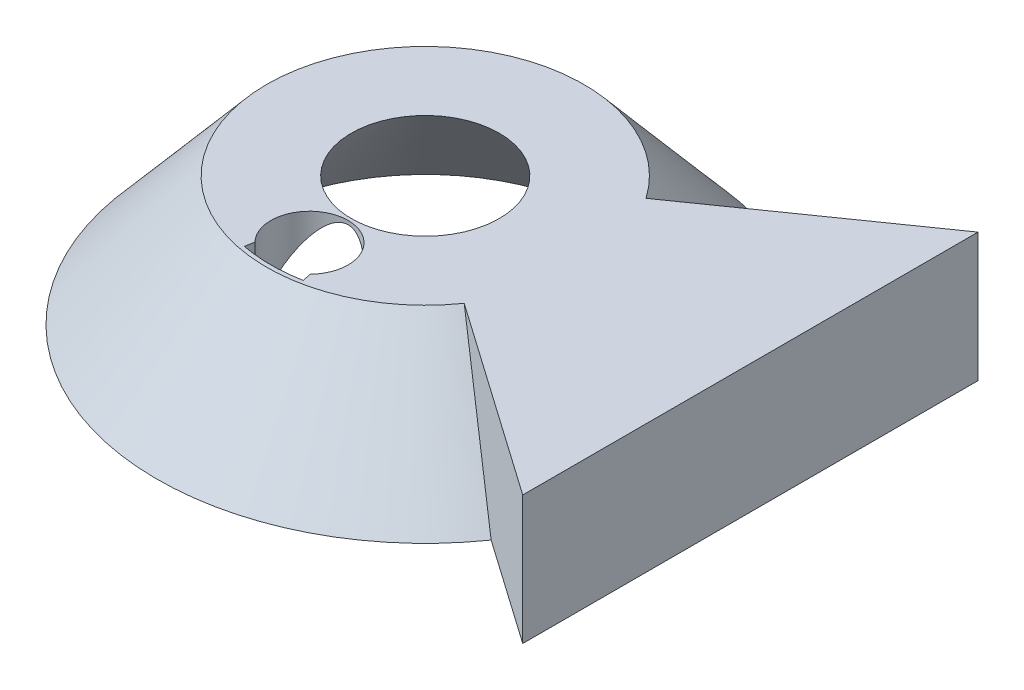
ISO-10303-21;
HEADER;
FILE_DESCRIPTION(('STEP AP214'),'2;1');
FILE_NAME('part.step','',(''),(''),'','','');
FILE_SCHEMA(('AUTOMOTIVE_DESIGN { 1 0 10303 214 1 1 1 1 }'));
ENDSEC;
DATA;
#1=APPLICATION_CONTEXT('core data for automotive mechanical design processes');
#2=APPLICATION_PROTOCOL_DEFINITION('international standard','automotive_design',2000,#1);
#3=PRODUCT_CONTEXT('',#1,'mechanical');
#4=PRODUCT('Part','Part','',(#3));
#5=PRODUCT_RELATED_PRODUCT_CATEGORY('part','',(#4));
#6=PRODUCT_DEFINITION_FORMATION('','',#4);
#7=PRODUCT_DEFINITION_CONTEXT('part definition',#1,'design');
#8=PRODUCT_DEFINITION('design','',#6,#7);
#9=PRODUCT_DEFINITION_SHAPE('','',#8);
#10=(LENGTH_UNIT() NAMED_UNIT(*) SI_UNIT(.MILLI.,.METRE.));
#11=(NAMED_UNIT(*) PLANE_ANGLE_UNIT() SI_UNIT($,.RADIAN.));
#12=(NAMED_UNIT(*) SI_UNIT($,.STERADIAN.) SOLID_ANGLE_UNIT());
#13=UNCERTAINTY_MEASURE_WITH_UNIT(LENGTH_MEASURE(1.E-05),#10,'distance_accuracy_value','');
#14=(GEOMETRIC_REPRESENTATION_CONTEXT(3) GLOBAL_UNCERTAINTY_ASSIGNED_CONTEXT((#13)) GLOBAL_UNIT_ASSIGNED_CONTEXT((#10,
#11,#12)) REPRESENTATION_CONTEXT('',''));
#15=CARTESIAN_POINT('',(0.,0.,0.));
#16=DIRECTION('',(0.,0.,1.));
#17=DIRECTION('',(1.,0.,0.));
#18=AXIS2_PLACEMENT_3D('',#15,#16,#17);
#19=CARTESIAN_POINT('',(0.,20.,0.));
#20=DIRECTION('',(0.,-1.,0.));
#21=DIRECTION('',(0.,0.,-1.));
#22=AXIS2_PLACEMENT_3D('',#19,#20,#21);
#23=CONICAL_SURFACE('',#22,11.5,0.705943653717558);
#24=CARTESIAN_POINT('',(0.,20.,0.));
#25=DIRECTION('',(0.,-1.,0.));
#26=DIRECTION('',(0.,0.,-1.));
#27=AXIS2_PLACEMENT_3D('',#24,#25,#26);
#28=CIRCLE('',#27,11.5);
#29=CARTESIAN_POINT('',(0.,20.,-11.5));
#30=VERTEX_POINT('',#29);
#31=EDGE_CURVE('E186',#30,#30,#28,.T.);
#32=ORIENTED_EDGE('',*,*,#31,.F.);
#33=EDGE_LOOP('',(#32));
#34=FACE_BOUND('',#33,.T.);
#35=CARTESIAN_POINT('',(0.,0.,0.));
#36=DIRECTION('',(0.,-1.,0.));
#37=DIRECTION('',(0.,0.,-1.));
#38=AXIS2_PLACEMENT_3D('',#35,#36,#37);
#39=CIRCLE('',#38,28.55);
#40=CARTESIAN_POINT('',(-5.44759681800036,0.,28.0254560874308));
#41=VERTEX_POINT('',#40);
#42=CARTESIAN_POINT('',(5.44759681800036,0.,28.0254560874308));
#43=VERTEX_POINT('',#42);
#44=EDGE_CURVE('E183',#41,#43,#39,.T.);
#45=ORIENTED_EDGE('',*,*,#44,.T.);
#46=DIRECTION('',(-0.123787762870703,0.760999693219683,-0.636832832604457));
#47=VECTOR('',#46,1.);
#48=CARTESIAN_POINT('',(0.,33.4897360703812,0.));
#49=LINE('',#48,#47);
#50=CARTESIAN_POINT('',(4.31018887788478,6.99234781710755,22.1739995013127));
#51=VERTEX_POINT('',#50);
#52=EDGE_CURVE('E143',#43,#51,#49,.T.);
#53=ORIENTED_EDGE('',*,*,#52,.T.);
#54=CARTESIAN_POINT('',(-1.86294938744595,5.59935199587434,23.7034568096738));
#55=CARTESIAN_POINT('',(-1.74380419760398,5.56479048565835,23.7423760429648));
#56=CARTESIAN_POINT('',(-1.62263230867238,5.53338015263106,23.7778186288156));
#57=CARTESIAN_POINT('',(-1.37685508627445,5.47722805546746,23.8412637521039));
#58=CARTESIAN_POINT('',(-1.25225062509791,5.45248461405185,23.8692681608382));
#59=CARTESIAN_POINT('',(-1.00028195179229,5.40997738774682,23.9174233599859));
#60=CARTESIAN_POINT('',(-0.872916190202574,5.3922176345229,23.9375696138524));
#61=CARTESIAN_POINT('',(-0.616405106274186,5.36395179737651,23.9696518118307));
#62=CARTESIAN_POINT('',(-0.487260515654808,5.35344281668845,23.981591034737));
#63=CARTESIAN_POINT('',(-0.227830250952314,5.33980845950456,23.9970835687338));
#64=CARTESIAN_POINT('',(-0.0975428660866593,5.33669725207927,24.0006207873209));
#65=CARTESIAN_POINT('',(0.162950907603768,5.33794637877211,23.9992009525263));
#66=CARTESIAN_POINT('',(0.293157295526494,5.34230679466108,23.9942438061808));
#67=CARTESIAN_POINT('',(0.552485304779401,5.35843251608129,23.9759228006164));
#68=CARTESIAN_POINT('',(0.68160714807975,5.37019626703128,23.9625607063016));
#69=CARTESIAN_POINT('',(0.937909342353687,5.40096028314342,23.9276523423152));
#70=CARTESIAN_POINT('',(1.06508896715261,5.41996318922954,23.9061030858838));
#71=CARTESIAN_POINT('',(1.31404313697651,5.4644827410833,23.8556883358527));
#72=CARTESIAN_POINT('',(1.43587502060802,5.48985852872847,23.8269811396661));
#73=CARTESIAN_POINT('',(1.67613502864785,5.54698032016049,23.7624706795175));
#74=CARTESIAN_POINT('',(1.79456195338372,5.57872853845588,23.7266649487691));
#75=CARTESIAN_POINT('',(2.14373823381104,5.68298002704705,23.6093279242177));
#76=CARTESIAN_POINT('',(2.36856216446425,5.764522810815,23.517839598931));
#77=CARTESIAN_POINT('',(2.81916516846089,5.95719008395895,23.3028824718996));
#78=CARTESIAN_POINT('',(3.04296616906288,6.07040218896967,23.1771874562883));
#79=CARTESIAN_POINT('',(3.46485607359706,6.31747784537985,22.904888212415));
#80=CARTESIAN_POINT('',(3.66292823216758,6.45135472345159,22.7582704957834));
#81=CARTESIAN_POINT('',(4.12967888533117,6.81063571254922,22.3681268818901));
#82=CARTESIAN_POINT('',(4.38104973490738,7.04726935838683,22.1140454775121));
#83=CARTESIAN_POINT('',(4.7135905544143,7.42321298352985,21.7164676229729));
#84=CARTESIAN_POINT('',(4.81714015607364,7.5522360494114,21.5809831048258));
#85=CARTESIAN_POINT('',(5.00998925325655,7.81637161569437,21.3057815616582));
#86=CARTESIAN_POINT('',(5.09928861090755,7.95148417499605,21.166064495703));
#87=CARTESIAN_POINT('',(5.29421299527155,8.27706812742472,20.8321600757922));
#88=CARTESIAN_POINT('',(5.39391915442332,8.46976209278792,20.6366862364186));
#89=CARTESIAN_POINT('',(5.56927281955039,8.86285963225087,20.2427011992367));
#90=CARTESIAN_POINT('',(5.64491203183782,9.06326583744731,20.0441889790215));
#91=CARTESIAN_POINT('',(5.77357750894172,9.47032389697082,19.646081555344));
#92=CARTESIAN_POINT('',(5.82659230782181,9.67697886146192,19.4464858545468));
#93=CARTESIAN_POINT('',(5.9112857048035,10.0951639271261,19.0479519099164));
#94=CARTESIAN_POINT('',(5.94296430856114,10.3066940270067,18.849013665909));
#95=CARTESIAN_POINT('',(5.99259340194851,10.796948535271,18.3943517248175));
#96=CARTESIAN_POINT('',(6.00368421656465,11.0769921706678,18.1392884414587));
#97=CARTESIAN_POINT('',(5.99418875297211,11.641614921383,17.6347818774464));
#98=CARTESIAN_POINT('',(5.97359256642718,11.9261954278141,17.3853403794412));
#99=CARTESIAN_POINT('',(5.90231140606635,12.4988833238075,16.8933504385717));
#100=CARTESIAN_POINT('',(5.8515439499306,12.786998253212,16.650822808763));
#101=CARTESIAN_POINT('',(5.72105059825576,13.364228314377,16.1750544108192));
#102=CARTESIAN_POINT('',(5.64132960132429,13.6533432687538,15.9418120791206));
#103=CARTESIAN_POINT('',(5.45223962566235,14.234730584037,15.4829575116101));
#104=CARTESIAN_POINT('',(5.34248422539866,14.526992759688,15.2574911467505));
#105=CARTESIAN_POINT('',(5.09361638086092,15.1086142861263,14.8190129109157));
#106=CARTESIAN_POINT('',(4.95448954208376,15.3979721404419,14.6060072123365));
#107=CARTESIAN_POINT('',(4.64648413165218,15.9692944972206,14.195291132906));
#108=CARTESIAN_POINT('',(4.47775773793367,16.2512887239851,13.9975096255083));
#109=CARTESIAN_POINT('',(4.20027354123233,16.6661745338304,13.7133746163533));
#110=CARTESIAN_POINT('',(4.10375978622619,16.8030617502792,13.620789615777));
#111=CARTESIAN_POINT('',(3.90206107092067,17.0733736318281,13.4401482183821));
#112=CARTESIAN_POINT('',(3.79687756343935,17.2067988721557,13.352091066817));
#113=CARTESIAN_POINT('',(3.52768903402684,17.5283500464608,13.1423996425853));
#114=CARTESIAN_POINT('',(3.35854148102995,17.7140225710926,13.0235222414697));
#115=CARTESIAN_POINT('',(2.99786993048949,18.0717345036145,12.7982640603044));
#116=CARTESIAN_POINT('',(2.80631730643837,18.2437559885507,12.6918996234474));
#117=CARTESIAN_POINT('',(2.49900872470258,18.4866012850122,12.5439890913945));
#118=CARTESIAN_POINT('',(2.39250351696613,18.5654684710095,12.4963612397621));
#119=CARTESIAN_POINT('',(2.1726783221403,18.7163056342005,12.405931123854));
#120=CARTESIAN_POINT('',(2.05935704580326,18.7882742998316,12.3631297769327));
#121=CARTESIAN_POINT('',(1.82606645033139,18.9233795614425,12.2833031858903));
#122=CARTESIAN_POINT('',(1.70611810754057,18.9865420200402,12.2462609893911));
#123=CARTESIAN_POINT('',(1.45947691008835,19.1021934791715,12.1788088516558));
#124=CARTESIAN_POINT('',(1.33278930264018,19.1546906345979,12.1483938418472));
#125=CARTESIAN_POINT('',(1.04001985561293,19.2585214260149,12.0884905828192));
#126=CARTESIAN_POINT('',(0.872120302043125,19.3061558814126,12.0612098360279));
#127=CARTESIAN_POINT('',(0.529609226239602,19.3766477554397,12.0209399159072));
#128=CARTESIAN_POINT('',(0.355006306167742,19.3995358975389,12.0079330207574));
#129=CARTESIAN_POINT('',(0.00319616844444349,19.4180362380601,11.9974143740765));
#130=CARTESIAN_POINT('',(-0.174018186591784,19.4135494407435,11.9999588609209));
#131=CARTESIAN_POINT('',(-0.524807713158865,19.3776190667305,12.0204066493788));
#132=CARTESIAN_POINT('',(-0.698379790816873,19.3461534530748,12.0383225067131));
#133=CARTESIAN_POINT('',(-1.07314487356277,19.2505160132696,12.0931050600018));
#134=CARTESIAN_POINT('',(-1.27243814589621,19.1808439947157,12.1331727874612));
#135=CARTESIAN_POINT('',(-1.65550797980911,19.0150557636623,12.2295108408982));
#136=CARTESIAN_POINT('',(-1.83925180705645,18.91888549317,12.2858142997728));
#137=CARTESIAN_POINT('',(-2.15310186619664,18.7300559535227,12.3977070492609));
#138=CARTESIAN_POINT('',(-2.28630463600886,18.640999801987,12.4509015985086));
#139=CARTESIAN_POINT('',(-2.5432488386985,18.4537628898462,12.5638622525242));
#140=CARTESIAN_POINT('',(-2.66698454299763,18.3555766829526,12.6236322836613));
#141=CARTESIAN_POINT('',(-2.90575312492365,18.1520560462594,12.7488282574268));
#142=CARTESIAN_POINT('',(-3.02077005269096,18.046709154068,12.8142641179524));
#143=CARTESIAN_POINT('',(-3.24255705168494,17.8305610482161,12.949978285231));
#144=CARTESIAN_POINT('',(-3.34932414175993,17.7197578863464,13.0202583252742));
#145=CARTESIAN_POINT('',(-3.63342212978878,17.4081221899469,13.2201073434366));
#146=CARTESIAN_POINT('',(-3.802746350501,17.2028386099339,13.3541595233672));
#147=CARTESIAN_POINT('',(-4.12032915082203,16.7836482350433,13.6333561042632));
#148=CARTESIAN_POINT('',(-4.26857274588448,16.5697354436206,13.7785082837501));
#149=CARTESIAN_POINT('',(-4.54589444420013,16.1358813213539,14.078693167588));
#150=CARTESIAN_POINT('',(-4.67494109995002,15.9159307828562,14.2337415024123));
#151=CARTESIAN_POINT('',(-4.91466337792563,15.4723988270992,14.5524186071945));
#152=CARTESIAN_POINT('',(-5.02534185725302,15.2488179804716,14.7160460374858));
#153=CARTESIAN_POINT('',(-5.26233059608747,14.7258723923021,15.1059343491555));
#154=CARTESIAN_POINT('',(-5.38190303704757,14.4256518089002,15.3351683735406));
#155=CARTESIAN_POINT('',(-5.5902773334973,13.8238549988058,15.8056899404441));
#156=CARTESIAN_POINT('',(-5.67906811071616,13.5222783235309,16.0469817868811));
#157=CARTESIAN_POINT('',(-5.82526539083548,12.9201156310487,16.5397630641122));
#158=CARTESIAN_POINT('',(-5.88268877732245,12.6195291676345,16.7912469305612));
#159=CARTESIAN_POINT('',(-5.96496144890567,12.0211904673515,17.3026617458611));
#160=CARTESIAN_POINT('',(-5.98982139755314,11.7234373343761,17.5625899008715));
#161=CARTESIAN_POINT('',(-6.00357062872514,11.1922973917804,18.0356988478775));
#162=CARTESIAN_POINT('',(-5.99870371105071,10.9580411184713,18.247734198597));
#163=CARTESIAN_POINT('',(-5.96580029888605,10.4936367984974,18.6745693285414));
#164=CARTESIAN_POINT('',(-5.93776343409561,10.2634888175511,18.8893691518938));
#165=CARTESIAN_POINT('',(-5.85712627901809,9.80890913257737,19.3198335853803));
#166=CARTESIAN_POINT('',(-5.80455902577437,9.58447016715269,19.5354966468112));
#167=CARTESIAN_POINT('',(-5.6732362910767,9.14256276203083,19.9659622880053));
#168=CARTESIAN_POINT('',(-5.59448971760699,8.92509197884345,20.1807651353447));
#169=CARTESIAN_POINT('',(-5.43499697763848,8.55869759890274,20.5473084267869));
#170=CARTESIAN_POINT('',(-5.36099355540794,8.40764104457023,20.6998544655908));
#171=CARTESIAN_POINT('',(-5.1978123240404,8.11099503990189,21.0020415698147));
#172=CARTESIAN_POINT('',(-5.10863512776564,7.96540536905076,21.1516827522887));
#173=CARTESIAN_POINT('',(-4.8173437871787,7.53847331078994,21.5941281690856));
#174=CARTESIAN_POINT('',(-4.59125894977654,7.26646600255077,21.8809583489117));
#175=CARTESIAN_POINT('',(-4.13139877394009,6.81780185477423,22.3605804189933));
#176=CARTESIAN_POINT('',(-3.91163164700737,6.63367941493392,22.5597316411202));
#177=CARTESIAN_POINT('',(-3.55187654858598,6.37858010304567,22.8380920851488));
#178=CARTESIAN_POINT('',(-3.42703957843472,6.29711118553164,22.9274285620864));
#179=CARTESIAN_POINT('',(-3.16747370624176,6.14204948333866,23.0981584308229));
#180=CARTESIAN_POINT('',(-3.03274891777469,6.06845345431175,23.1795550933209));
#181=CARTESIAN_POINT('',(-2.73329979146013,5.91995319921601,23.3443808107184));
#182=CARTESIAN_POINT('',(-2.56707410424427,5.84644131106108,23.426355859862));
#183=CARTESIAN_POINT('',(-2.22313533180117,5.71260422843983,23.5760935739851));
#184=CARTESIAN_POINT('',(-2.04541913417105,5.65228262634222,23.6438523669703));
#185=CARTESIAN_POINT('',(-1.86294938744595,5.59935199587434,23.7034568096738));
#186=B_SPLINE_CURVE_WITH_KNOTS('',3,(#54,#55,#56,#57,#58,#59,#60,#61,#62,#63,#64,#65,#66,#67,
#68,#69,#70,#71,#72,#73,#74,#75,#76,#77,#78,#79,#80,#81,#82,#83,#84,#85,#86,#87,#88,#89,#90,#91,
#92,#93,#94,#95,#96,#97,#98,#99,#100,#101,#102,#103,#104,#105,#106,#107,#108,#109,#110,#111,
#112,#113,#114,#115,#116,#117,#118,#119,#120,#121,#122,#123,#124,#125,#126,#127,#128,#129,#130,
#131,#132,#133,#134,#135,#136,#137,#138,#139,#140,#141,#142,#143,#144,#145,#146,#147,#148,#149,
#150,#151,#152,#153,#154,#155,#156,#157,#158,#159,#160,#161,#162,#163,#164,#165,#166,#167,#168,
#169,#170,#171,#172,#173,#174,#175,#176,#177,#178,#179,#180,#181,#182,#183,#184,#185),
.UNSPECIFIED.,.T.,.F.,(4,2,2,2,2,2,2,2,2,2,2,2,2,2,2,2,2,2,2,2,2,2,2,2,2,2,2,2,2,2,2,2,2,2,2,2,
2,2,2,2,2,2,2,2,2,2,2,2,2,2,2,2,2,2,2,2,2,2,2,2,2,2,2,2,2,4),(0.,0.389910283155963,
0.779722379566553,1.16975918429395,1.55964007454038,1.95026711034394,2.34089842127013,
2.73144773326332,3.12213965862462,3.50485773913822,3.88770905051441,4.65286040107493,
5.49142619346347,6.33053505231154,7.60884340924193,8.2499264152357,8.89101562339726,
9.76585069620161,10.6409869193962,11.5165661319455,12.3921451123863,13.5274504389633,
14.6631108409041,15.8018902897378,16.9404771598114,18.0944640630846,19.2490178364687,
20.3978010245632,20.9716991918266,21.545501383904,22.3779536522444,23.2114813917391,
23.6336245764337,24.0558478614274,24.476803766492,24.8974365791475,25.4251628381445,
25.952233150295,26.4812106289077,27.0106206013883,27.6517377717821,28.2941726683758,
28.7999781452238,29.3060873063467,29.8131010380907,30.3202971351273,31.2127769421448,
32.1058880047391,33.0004463780478,33.8948654754421,35.08199072703,36.2695427806059,
37.4564549995069,38.6429784429318,39.5901850931463,40.5374068818332,41.4833566364564,
42.4289848435582,43.1096499914003,43.7902876539912,45.1493585009262,46.1924589703113,
46.7132738446255,47.2338732621594,47.8308548375714,48.4279987987112),.UNSPECIFIED.);
#187=CARTESIAN_POINT('',(-4.31018887788477,6.99234781710756,22.1739995013127));
#188=VERTEX_POINT('',#187);
#189=EDGE_CURVE('E152',#51,#188,#186,.T.);
#190=ORIENTED_EDGE('',*,*,#189,.T.);
#191=DIRECTION('',(0.123787762870703,0.760999693219683,-0.636832832604456));
#192=VECTOR('',#191,1.);
#193=CARTESIAN_POINT('',(0.,33.4897360703812,0.));
#194=LINE('',#193,#192);
#195=EDGE_CURVE('E48',#41,#188,#194,.T.);
#196=ORIENTED_EDGE('',*,*,#195,.F.);
#197=EDGE_LOOP('',(#45,#53,#190,#196));
#198=FACE_BOUND('',#197,.T.);
#199=ADVANCED_FACE('F33',(#34,#198),#23,.F.);
#200=CARTESIAN_POINT('',(0.,20.,-24.6406097651517));
#201=DIRECTION('',(0.,1.,0.));
#202=DIRECTION('',(0.,0.,1.));
#203=AXIS2_PLACEMENT_3D('',#200,#201,#202);
#204=PLANE('',#203);
#205=DIRECTION('',(0.,0.,1.));
#206=VECTOR('',#205,1.);
#207=CARTESIAN_POINT('',(50.5339891025584,20.,-24.6406097651517));
#208=LINE('',#207,#206);
#209=CARTESIAN_POINT('',(50.5339891025584,20.,-35.3842801054188));
#210=VERTEX_POINT('',#209);
#211=CARTESIAN_POINT('',(50.5339891025584,20.,35.3842801054188));
#212=VERTEX_POINT('',#211);
#213=EDGE_CURVE('E157',#210,#212,#208,.T.);
#214=ORIENTED_EDGE('',*,*,#213,.F.);
#215=DIRECTION('',(-0.819152044288991,0.,0.573576436351047));
#216=VECTOR('',#215,1.);
#217=CARTESIAN_POINT('',(20.1844058616513,20.,-14.1332731386125));
#218=LINE('',#217,#216);
#219=CARTESIAN_POINT('',(20.1844058616513,20.,-14.1332731386125));
#220=VERTEX_POINT('',#219);
#221=EDGE_CURVE('E175',#210,#220,#218,.T.);
#222=ORIENTED_EDGE('',*,*,#221,.T.);
#223=CARTESIAN_POINT('',(0.,20.,0.));
#224=DIRECTION('',(0.,-1.,0.));
#225=DIRECTION('',(0.,0.,-1.));
#226=AXIS2_PLACEMENT_3D('',#223,#224,#225);
#227=CIRCLE('',#226,24.6406097651517);
#228=CARTESIAN_POINT('',(20.1844058616513,20.,14.1332731386125));
#229=VERTEX_POINT('',#228);
#230=EDGE_CURVE('E177',#229,#220,#227,.T.);
#231=ORIENTED_EDGE('',*,*,#230,.F.);
#232=DIRECTION('',(-0.819152044288991,0.,-0.573576436351047));
#233=VECTOR('',#232,1.);
#234=CARTESIAN_POINT('',(20.1844058616513,20.,14.1332731386125));
#235=LINE('',#234,#233);
#236=EDGE_CURVE('E56',#212,#229,#235,.T.);
#237=ORIENTED_EDGE('',*,*,#236,.F.);
#238=EDGE_LOOP('',(#214,#222,#231,#237));
#239=FACE_BOUND('',#238,.T.);
#240=ORIENTED_EDGE('',*,*,#31,.T.);
#241=EDGE_LOOP('',(#240));
#242=FACE_BOUND('',#241,.T.);
#243=CARTESIAN_POINT('',(0.,20.,18.));
#244=DIRECTION('',(0.,1.,0.));
#245=DIRECTION('',(0.,0.,1.));
#246=AXIS2_PLACEMENT_3D('',#243,#244,#245);
#247=CIRCLE('',#246,6.);
#248=CARTESIAN_POINT('',(-4.31018887788478,20.,22.1739995013127));
#249=VERTEX_POINT('',#248);
#250=CARTESIAN_POINT('',(4.31018887788478,20.,22.1739995013127));
#251=VERTEX_POINT('',#250);
#252=EDGE_CURVE('E153',#249,#251,#247,.F.);
#253=ORIENTED_EDGE('',*,*,#252,.T.);
#254=DIRECTION('',(0.190808995376545,0.,0.981627183447664));
#255=VECTOR('',#254,1.);
#256=CARTESIAN_POINT('',(4.57941588903708,20.,23.5590524027439));
#257=LINE('',#256,#255);
#258=CARTESIAN_POINT('',(4.57941588903708,20.,23.5590524027439));
#259=VERTEX_POINT('',#258);
#260=EDGE_CURVE('E131',#251,#259,#257,.T.);
#261=ORIENTED_EDGE('',*,*,#260,.T.);
#262=CARTESIAN_POINT('',(0.,20.,0.));
#263=DIRECTION('',(0.,-1.,0.));
#264=DIRECTION('',(0.,0.,-1.));
#265=AXIS2_PLACEMENT_3D('',#262,#263,#264);
#266=CIRCLE('',#265,24.);
#267=CARTESIAN_POINT('',(-4.57941588903708,20.,23.5590524027439));
#268=VERTEX_POINT('',#267);
#269=EDGE_CURVE('E125',#259,#268,#266,.T.);
#270=ORIENTED_EDGE('',*,*,#269,.T.);
#271=DIRECTION('',(-0.190808995376545,0.,0.981627183447664));
#272=VECTOR('',#271,1.);
#273=CARTESIAN_POINT('',(-4.57941588903708,20.,23.5590524027439));
#274=LINE('',#273,#272);
#275=EDGE_CURVE('E111',#249,#268,#274,.T.);
#276=ORIENTED_EDGE('',*,*,#275,.F.);
#277=EDGE_LOOP('',(#253,#261,#270,#276));
#278=FACE_BOUND('',#277,.T.);
#279=ADVANCED_FACE('F35',(#239,#242,#278),#204,.T.);
#280=CARTESIAN_POINT('',(0.,0.,-28.55));
#281=DIRECTION('',(0.,-1.,0.));
#282=DIRECTION('',(0.,0.,-1.));
#283=AXIS2_PLACEMENT_3D('',#280,#281,#282);
#284=PLANE('',#283);
#285=DIRECTION('',(0.,0.,-1.));
#286=VECTOR('',#285,1.);
#287=CARTESIAN_POINT('',(50.5339891025584,0.,-28.55));
#288=LINE('',#287,#286);
#289=CARTESIAN_POINT('',(50.5339891025584,0.,35.3842801054188));
#290=VERTEX_POINT('',#289);
#291=CARTESIAN_POINT('',(50.5339891025584,0.,-35.3842801054188));
#292=VERTEX_POINT('',#291);
#293=EDGE_CURVE('E155',#290,#292,#288,.T.);
#294=ORIENTED_EDGE('',*,*,#293,.F.);
#295=DIRECTION('',(0.819152044288991,0.,0.573576436351047));
#296=VECTOR('',#295,1.);
#297=CARTESIAN_POINT('',(34.1509482167786,0.,23.9127513783979));
#298=LINE('',#297,#296);
#299=CARTESIAN_POINT('',(34.1509482167786,0.,23.9127513783979));
#300=VERTEX_POINT('',#299);
#301=EDGE_CURVE('E161',#300,#290,#298,.T.);
#302=ORIENTED_EDGE('',*,*,#301,.F.);
#303=CARTESIAN_POINT('',(0.,0.,0.));
#304=DIRECTION('',(0.,-1.,0.));
#305=DIRECTION('',(0.,0.,-1.));
#306=AXIS2_PLACEMENT_3D('',#303,#304,#305);
#307=CIRCLE('',#306,41.6906097651517);
#308=CARTESIAN_POINT('',(34.1509482167786,0.,-23.9127513783979));
#309=VERTEX_POINT('',#308);
#310=EDGE_CURVE('E180',#300,#309,#307,.T.);
#311=ORIENTED_EDGE('',*,*,#310,.T.);
#312=DIRECTION('',(0.819152044288991,0.,-0.573576436351047));
#313=VECTOR('',#312,1.);
#314=CARTESIAN_POINT('',(34.1509482167786,0.,-23.9127513783979));
#315=LINE('',#314,#313);
#316=EDGE_CURVE('E170',#309,#292,#315,.T.);
#317=ORIENTED_EDGE('',*,*,#316,.T.);
#318=EDGE_LOOP('',(#294,#302,#311,#317));
#319=FACE_BOUND('',#318,.T.);
#320=CARTESIAN_POINT('',(0.,0.,0.));
#321=DIRECTION('',(0.,-1.,0.));
#322=DIRECTION('',(0.,0.,-1.));
#323=AXIS2_PLACEMENT_3D('',#320,#321,#322);
#324=CIRCLE('',#323,36.5474053843329);
#325=CARTESIAN_POINT('',(-6.97357370500389,0.,35.8759266097427));
#326=VERTEX_POINT('',#325);
#327=CARTESIAN_POINT('',(6.97357370500389,0.,35.8759266097427));
#328=VERTEX_POINT('',#327);
#329=EDGE_CURVE('E149',#326,#328,#324,.F.);
#330=ORIENTED_EDGE('',*,*,#329,.T.);
#331=DIRECTION('',(-0.190808995376545,0.,-0.981627183447664));
#332=VECTOR('',#331,1.);
#333=CARTESIAN_POINT('',(-5.34750912101215,0.,-27.5105495239409));
#334=LINE('',#333,#332);
#335=EDGE_CURVE('E146',#328,#43,#334,.T.);
#336=ORIENTED_EDGE('',*,*,#335,.T.);
#337=ORIENTED_EDGE('',*,*,#44,.F.);
#338=DIRECTION('',(0.190808995376545,0.,-0.981627183447664));
#339=VECTOR('',#338,1.);
#340=CARTESIAN_POINT('',(5.34750912101215,0.,-27.5105495239409));
#341=LINE('',#340,#339);
#342=EDGE_CURVE('E141',#326,#41,#341,.T.);
#343=ORIENTED_EDGE('',*,*,#342,.F.);
#344=EDGE_LOOP('',(#330,#336,#337,#343));
#345=FACE_BOUND('',#344,.T.);
#346=ADVANCED_FACE('F201',(#319,#345),#284,.T.);
#347=CARTESIAN_POINT('',(0.,40.,18.));
#348=DIRECTION('',(0.,-1.,0.));
#349=DIRECTION('',(0.,0.,-1.));
#350=AXIS2_PLACEMENT_3D('',#347,#348,#349);
#351=CYLINDRICAL_SURFACE('',#350,6.);
#352=ORIENTED_EDGE('',*,*,#189,.F.);
#353=DIRECTION('',(0.,-1.,0.));
#354=VECTOR('',#353,1.);
#355=CARTESIAN_POINT('',(4.31018887788478,40.,22.1739995013127));
#356=LINE('',#355,#354);
#357=EDGE_CURVE('E11',#51,#251,#356,.F.);
#358=ORIENTED_EDGE('',*,*,#357,.T.);
#359=ORIENTED_EDGE('',*,*,#252,.F.);
#360=DIRECTION('',(0.,-1.,0.));
#361=VECTOR('',#360,1.);
#362=CARTESIAN_POINT('',(-4.31018887788478,40.,22.1739995013127));
#363=LINE('',#362,#361);
#364=EDGE_CURVE('E41',#188,#249,#363,.F.);
#365=ORIENTED_EDGE('',*,*,#364,.F.);
#366=EDGE_LOOP('',(#352,#358,#359,#365));
#367=FACE_BOUND('',#366,.T.);
#368=ADVANCED_FACE('F195',(#367),#351,.F.);
#369=CARTESIAN_POINT('',(0.,0.,0.));
#370=DIRECTION('',(0.,-1.,0.));
#371=DIRECTION('',(0.,0.,-1.));
#372=AXIS2_PLACEMENT_3D('',#369,#370,#371);
#373=CONICAL_SURFACE('',#372,41.6906097651517,0.705943653717558);
#374=DIRECTION('',(0.531426722379579,-0.760999693219682,-0.372108997016261));
#375=VECTOR('',#374,1.);
#376=CARTESIAN_POINT('',(34.1509482167786,0.,-23.9127513783979));
#377=LINE('',#376,#375);
#378=EDGE_CURVE('E167',#220,#309,#377,.T.);
#379=ORIENTED_EDGE('',*,*,#378,.T.);
#380=ORIENTED_EDGE('',*,*,#310,.F.);
#381=DIRECTION('',(0.531426722379579,-0.760999693219682,0.372108997016261));
#382=VECTOR('',#381,1.);
#383=CARTESIAN_POINT('',(34.1509482167786,0.,23.9127513783979));
#384=LINE('',#383,#382);
#385=EDGE_CURVE('E159',#229,#300,#384,.T.);
#386=ORIENTED_EDGE('',*,*,#385,.F.);
#387=ORIENTED_EDGE('',*,*,#230,.T.);
#388=EDGE_LOOP('',(#379,#380,#386,#387));
#389=FACE_BOUND('',#388,.T.);
#390=ADVANCED_FACE('F200',(#389),#373,.T.);
#391=CARTESIAN_POINT('',(0.,0.,0.));
#392=DIRECTION('',(-0.573576436351047,0.,-0.819152044288991));
#393=DIRECTION('',(-0.819152044288991,0.,0.573576436351047));
#394=AXIS2_PLACEMENT_3D('',#391,#392,#393);
#395=PLANE('',#394);
#396=ORIENTED_EDGE('',*,*,#378,.F.);
#397=ORIENTED_EDGE('',*,*,#221,.F.);
#398=DIRECTION('',(0.,1.,0.));
#399=VECTOR('',#398,1.);
#400=CARTESIAN_POINT('',(50.5339891025584,0.,-35.3842801054188));
#401=LINE('',#400,#399);
#402=EDGE_CURVE('E173',#292,#210,#401,.T.);
#403=ORIENTED_EDGE('',*,*,#402,.F.);
#404=ORIENTED_EDGE('',*,*,#316,.F.);
#405=EDGE_LOOP('',(#396,#397,#403,#404));
#406=FACE_BOUND('',#405,.T.);
#407=ADVANCED_FACE('F212',(#406),#395,.T.);
#408=CARTESIAN_POINT('',(0.,0.,0.));
#409=DIRECTION('',(0.573576436351047,0.,-0.819152044288991));
#410=DIRECTION('',(-0.819152044288991,0.,-0.573576436351047));
#411=AXIS2_PLACEMENT_3D('',#408,#409,#410);
#412=PLANE('',#411);
#413=ORIENTED_EDGE('',*,*,#385,.T.);
#414=ORIENTED_EDGE('',*,*,#301,.T.);
#415=DIRECTION('',(0.,1.,0.));
#416=VECTOR('',#415,1.);
#417=CARTESIAN_POINT('',(50.5339891025584,0.,35.3842801054188));
#418=LINE('',#417,#416);
#419=EDGE_CURVE('E164',#290,#212,#418,.T.);
#420=ORIENTED_EDGE('',*,*,#419,.T.);
#421=ORIENTED_EDGE('',*,*,#236,.T.);
#422=EDGE_LOOP('',(#413,#414,#420,#421));
#423=FACE_BOUND('',#422,.T.);
#424=ADVANCED_FACE('F208',(#423),#412,.F.);
#425=CARTESIAN_POINT('',(50.5339891025584,46.1291291043281,-41.6906097651517));
#426=DIRECTION('',(-1.,0.,0.));
#427=DIRECTION('',(0.,-1.,0.));
#428=AXIS2_PLACEMENT_3D('',#425,#426,#427);
#429=PLANE('',#428);
#430=ORIENTED_EDGE('',*,*,#402,.T.);
#431=ORIENTED_EDGE('',*,*,#213,.T.);
#432=ORIENTED_EDGE('',*,*,#419,.F.);
#433=ORIENTED_EDGE('',*,*,#293,.T.);
#434=EDGE_LOOP('',(#430,#431,#432,#433));
#435=FACE_BOUND('',#434,.T.);
#436=ADVANCED_FACE('F205',(#435),#429,.F.);
#437=CARTESIAN_POINT('',(0.,0.,0.));
#438=DIRECTION('',(0.,-1.,0.));
#439=DIRECTION('',(0.,0.,-1.));
#440=AXIS2_PLACEMENT_3D('',#437,#438,#439);
#441=CYLINDRICAL_SURFACE('',#440,24.);
#442=ORIENTED_EDGE('',*,*,#269,.F.);
#443=DIRECTION('',(0.,-1.,0.));
#444=VECTOR('',#443,1.);
#445=CARTESIAN_POINT('',(4.57941588903708,14.9459731696295,23.5590524027439));
#446=LINE('',#445,#444);
#447=CARTESIAN_POINT('',(4.57941588903708,14.9459731696295,23.5590524027439));
#448=VERTEX_POINT('',#447);
#449=EDGE_CURVE('E136',#259,#448,#446,.T.);
#450=ORIENTED_EDGE('',*,*,#449,.T.);
#451=CARTESIAN_POINT('',(0.,14.9459731696295,0.));
#452=DIRECTION('',(0.,-1.,0.));
#453=DIRECTION('',(0.,0.,-1.));
#454=AXIS2_PLACEMENT_3D('',#451,#452,#453);
#455=CIRCLE('',#454,24.);
#456=CARTESIAN_POINT('',(-4.57941588903708,14.9459731696295,23.5590524027439));
#457=VERTEX_POINT('',#456);
#458=EDGE_CURVE('E127',#448,#457,#455,.T.);
#459=ORIENTED_EDGE('',*,*,#458,.T.);
#460=DIRECTION('',(0.,-1.,0.));
#461=VECTOR('',#460,1.);
#462=CARTESIAN_POINT('',(-4.57941588903708,14.9459731696295,23.5590524027439));
#463=LINE('',#462,#461);
#464=EDGE_CURVE('E115',#268,#457,#463,.T.);
#465=ORIENTED_EDGE('',*,*,#464,.F.);
#466=EDGE_LOOP('',(#442,#450,#459,#465));
#467=FACE_BOUND('',#466,.T.);
#468=ADVANCED_FACE('F123',(#467),#441,.F.);
#469=CARTESIAN_POINT('',(0.,14.9459731696295,0.));
#470=DIRECTION('',(0.,-1.,0.));
#471=DIRECTION('',(0.,0.,-1.));
#472=AXIS2_PLACEMENT_3D('',#469,#470,#471);
#473=CONICAL_SURFACE('',#472,24.,0.698376840481285);
#474=DIRECTION('',(-0.122685485978287,-0.765886847352194,0.631162109590864));
#475=VECTOR('',#474,1.);
#476=CARTESIAN_POINT('',(-8.34524271069163,-8.5628975750467,42.9325519015355));
#477=LINE('',#476,#475);
#478=EDGE_CURVE('E128',#457,#326,#477,.T.);
#479=ORIENTED_EDGE('',*,*,#478,.F.);
#480=ORIENTED_EDGE('',*,*,#458,.F.);
#481=DIRECTION('',(0.122685485978287,-0.765886847352194,0.631162109590864));
#482=VECTOR('',#481,1.);
#483=CARTESIAN_POINT('',(8.34524271069162,-8.5628975750467,42.9325519015355));
#484=LINE('',#483,#482);
#485=EDGE_CURVE('E132',#448,#328,#484,.T.);
#486=ORIENTED_EDGE('',*,*,#485,.T.);
#487=ORIENTED_EDGE('',*,*,#329,.F.);
#488=EDGE_LOOP('',(#479,#480,#486,#487));
#489=FACE_BOUND('',#488,.T.);
#490=ADVANCED_FACE('F203',(#489),#473,.F.);
#491=CARTESIAN_POINT('',(0.,0.,0.));
#492=DIRECTION('',(-0.981627183447664,0.,0.190808995376545));
#493=DIRECTION('',(0.190808995376545,0.,0.981627183447664));
#494=AXIS2_PLACEMENT_3D('',#491,#492,#493);
#495=PLANE('',#494);
#496=ORIENTED_EDGE('',*,*,#485,.F.);
#497=ORIENTED_EDGE('',*,*,#449,.F.);
#498=ORIENTED_EDGE('',*,*,#260,.F.);
#499=ORIENTED_EDGE('',*,*,#357,.F.);
#500=ORIENTED_EDGE('',*,*,#52,.F.);
#501=ORIENTED_EDGE('',*,*,#335,.F.);
#502=EDGE_LOOP('',(#496,#497,#498,#499,#500,#501));
#503=FACE_BOUND('',#502,.T.);
#504=ADVANCED_FACE('F238',(#503),#495,.T.);
#505=CARTESIAN_POINT('',(0.,0.,0.));
#506=DIRECTION('',(-0.981627183447664,0.,-0.190808995376545));
#507=DIRECTION('',(-0.190808995376545,0.,0.981627183447664));
#508=AXIS2_PLACEMENT_3D('',#505,#506,#507);
#509=PLANE('',#508);
#510=ORIENTED_EDGE('',*,*,#342,.T.);
#511=ORIENTED_EDGE('',*,*,#195,.T.);
#512=ORIENTED_EDGE('',*,*,#364,.T.);
#513=ORIENTED_EDGE('',*,*,#275,.T.);
#514=ORIENTED_EDGE('',*,*,#464,.T.);
#515=ORIENTED_EDGE('',*,*,#478,.T.);
#516=EDGE_LOOP('',(#510,#511,#512,#513,#514,#515));
#517=FACE_BOUND('',#516,.T.);
#518=ADVANCED_FACE('F113',(#517),#509,.F.);
#519=CLOSED_SHELL('',(#199,#279,#346,#368,#390,#407,#424,#436,#468,#490,#504,#518));
#520=MANIFOLD_SOLID_BREP('B2',#519);
#521=ADVANCED_BREP_SHAPE_REPRESENTATION('',(#18,#520),#14);
#522=SHAPE_DEFINITION_REPRESENTATION(#9,#521);
ENDSEC;
END-ISO-10303-21;
